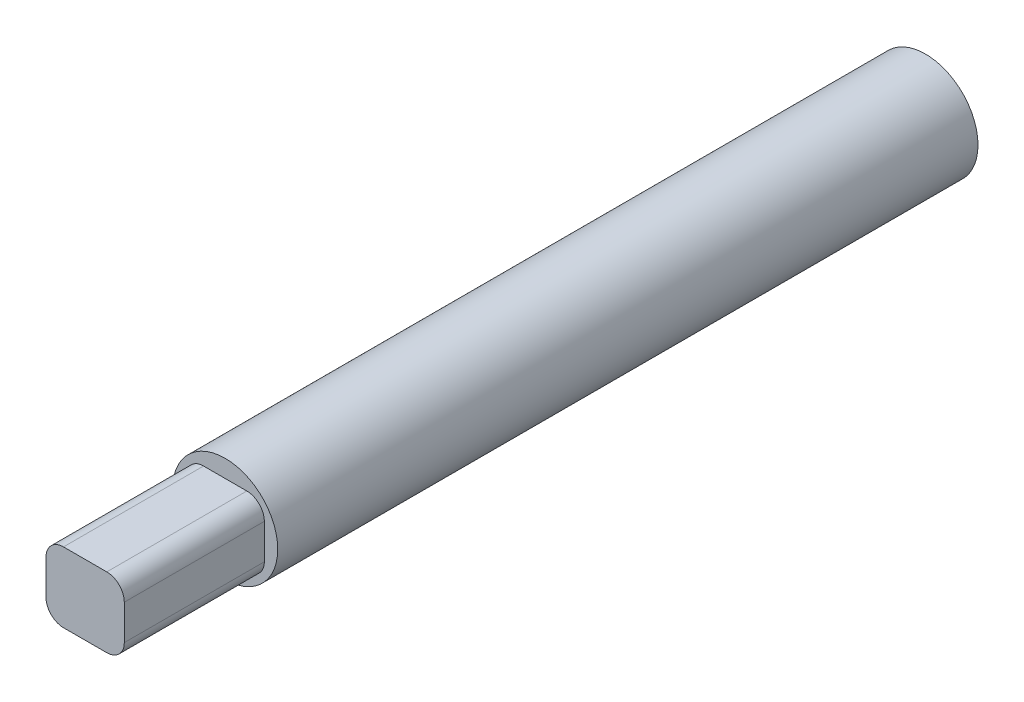
ISO-10303-21;
HEADER;
FILE_DESCRIPTION(('STEP AP214'),'2;1');
FILE_NAME('part.step','',(''),(''),'','','');
FILE_SCHEMA(('AUTOMOTIVE_DESIGN { 1 0 10303 214 1 1 1 1 }'));
ENDSEC;
DATA;
#1=APPLICATION_CONTEXT('core data for automotive mechanical design processes');
#2=APPLICATION_PROTOCOL_DEFINITION('international standard','automotive_design',2000,#1);
#3=PRODUCT_CONTEXT('',#1,'mechanical');
#4=PRODUCT('Part','Part','',(#3));
#5=PRODUCT_RELATED_PRODUCT_CATEGORY('part','',(#4));
#6=PRODUCT_DEFINITION_FORMATION('','',#4);
#7=PRODUCT_DEFINITION_CONTEXT('part definition',#1,'design');
#8=PRODUCT_DEFINITION('design','',#6,#7);
#9=PRODUCT_DEFINITION_SHAPE('','',#8);
#10=(LENGTH_UNIT() NAMED_UNIT(*) SI_UNIT(.MILLI.,.METRE.));
#11=(NAMED_UNIT(*) PLANE_ANGLE_UNIT() SI_UNIT($,.RADIAN.));
#12=(NAMED_UNIT(*) SI_UNIT($,.STERADIAN.) SOLID_ANGLE_UNIT());
#13=UNCERTAINTY_MEASURE_WITH_UNIT(LENGTH_MEASURE(1.E-05),#10,'distance_accuracy_value','');
#14=(GEOMETRIC_REPRESENTATION_CONTEXT(3) GLOBAL_UNCERTAINTY_ASSIGNED_CONTEXT((#13)) GLOBAL_UNIT_ASSIGNED_CONTEXT((#10,
#11,#12)) REPRESENTATION_CONTEXT('',''));
#15=CARTESIAN_POINT('',(0.,0.,0.));
#16=DIRECTION('',(0.,0.,1.));
#17=DIRECTION('',(1.,0.,0.));
#18=AXIS2_PLACEMENT_3D('',#15,#16,#17);
#19=CARTESIAN_POINT('',(0.,0.,40.));
#20=DIRECTION('',(0.,0.,1.));
#21=DIRECTION('',(1.,0.,0.));
#22=AXIS2_PLACEMENT_3D('',#19,#20,#21);
#23=PLANE('',#22);
#24=CARTESIAN_POINT('',(0.,0.,40.));
#25=DIRECTION('',(0.,0.,1.));
#26=DIRECTION('',(1.,0.,0.));
#27=AXIS2_PLACEMENT_3D('',#24,#25,#26);
#28=CIRCLE('',#27,3.);
#29=CARTESIAN_POINT('',(2.23606797749979,2.,40.));
#30=VERTEX_POINT('',#29);
#31=CARTESIAN_POINT('',(-2.23606797749979,2.,40.));
#32=VERTEX_POINT('',#31);
#33=EDGE_CURVE('E127',#30,#32,#28,.T.);
#34=ORIENTED_EDGE('',*,*,#33,.T.);
#35=CARTESIAN_POINT('',(-2.23606797749979,-2.,40.));
#36=VERTEX_POINT('',#35);
#37=EDGE_CURVE('E122',#32,#36,#28,.T.);
#38=ORIENTED_EDGE('',*,*,#37,.T.);
#39=CARTESIAN_POINT('',(2.23606797749979,-2.,40.));
#40=VERTEX_POINT('',#39);
#41=EDGE_CURVE('E116',#36,#40,#28,.T.);
#42=ORIENTED_EDGE('',*,*,#41,.T.);
#43=EDGE_CURVE('E120',#40,#30,#28,.T.);
#44=ORIENTED_EDGE('',*,*,#43,.T.);
#45=EDGE_LOOP('',(#34,#38,#42,#44));
#46=FACE_BOUND('',#45,.T.);
#47=DIRECTION('',(-1.,0.,0.));
#48=VECTOR('',#47,1.);
#49=CARTESIAN_POINT('',(2.23606797749979,2.,40.));
#50=LINE('',#49,#48);
#51=CARTESIAN_POINT('',(1.23606797749979,2.,40.));
#52=VERTEX_POINT('',#51);
#53=CARTESIAN_POINT('',(-1.23606797749979,2.,40.));
#54=VERTEX_POINT('',#53);
#55=EDGE_CURVE('E54',#52,#54,#50,.T.);
#56=ORIENTED_EDGE('',*,*,#55,.F.);
#57=CARTESIAN_POINT('',(1.23606797749979,1.,40.));
#58=DIRECTION('',(0.,0.,1.));
#59=DIRECTION('',(1.,0.,0.));
#60=AXIS2_PLACEMENT_3D('',#57,#58,#59);
#61=CIRCLE('',#60,1.);
#62=CARTESIAN_POINT('',(2.23606797749979,1.,40.));
#63=VERTEX_POINT('',#62);
#64=EDGE_CURVE('E47',#52,#63,#61,.F.);
#65=ORIENTED_EDGE('',*,*,#64,.T.);
#66=DIRECTION('',(0.,1.,0.));
#67=VECTOR('',#66,1.);
#68=CARTESIAN_POINT('',(2.23606797749979,-2.,40.));
#69=LINE('',#68,#67);
#70=CARTESIAN_POINT('',(2.23606797749979,-1.,40.));
#71=VERTEX_POINT('',#70);
#72=EDGE_CURVE('E61',#71,#63,#69,.T.);
#73=ORIENTED_EDGE('',*,*,#72,.F.);
#74=CARTESIAN_POINT('',(1.23606797749979,-1.,40.));
#75=DIRECTION('',(0.,0.,1.));
#76=DIRECTION('',(1.,0.,0.));
#77=AXIS2_PLACEMENT_3D('',#74,#75,#76);
#78=CIRCLE('',#77,1.);
#79=CARTESIAN_POINT('',(1.23606797749979,-2.,40.));
#80=VERTEX_POINT('',#79);
#81=EDGE_CURVE('E163',#71,#80,#78,.F.);
#82=ORIENTED_EDGE('',*,*,#81,.T.);
#83=DIRECTION('',(1.,0.,0.));
#84=VECTOR('',#83,1.);
#85=CARTESIAN_POINT('',(2.23606797749979,-2.,40.));
#86=LINE('',#85,#84);
#87=CARTESIAN_POINT('',(-1.23606797749979,-2.,40.));
#88=VERTEX_POINT('',#87);
#89=EDGE_CURVE('E188',#88,#80,#86,.T.);
#90=ORIENTED_EDGE('',*,*,#89,.F.);
#91=CARTESIAN_POINT('',(-1.23606797749979,-1.,40.));
#92=DIRECTION('',(0.,0.,1.));
#93=DIRECTION('',(1.,0.,0.));
#94=AXIS2_PLACEMENT_3D('',#91,#92,#93);
#95=CIRCLE('',#94,1.);
#96=CARTESIAN_POINT('',(-2.23606797749979,-1.,40.));
#97=VERTEX_POINT('',#96);
#98=EDGE_CURVE('E166',#88,#97,#95,.F.);
#99=ORIENTED_EDGE('',*,*,#98,.T.);
#100=DIRECTION('',(0.,-1.,0.));
#101=VECTOR('',#100,1.);
#102=CARTESIAN_POINT('',(-2.23606797749979,-2.,40.));
#103=LINE('',#102,#101);
#104=CARTESIAN_POINT('',(-2.23606797749979,1.,40.));
#105=VERTEX_POINT('',#104);
#106=EDGE_CURVE('E186',#105,#97,#103,.T.);
#107=ORIENTED_EDGE('',*,*,#106,.F.);
#108=CARTESIAN_POINT('',(-1.23606797749979,1.,40.));
#109=DIRECTION('',(0.,0.,1.));
#110=DIRECTION('',(1.,0.,0.));
#111=AXIS2_PLACEMENT_3D('',#108,#109,#110);
#112=CIRCLE('',#111,1.);
#113=EDGE_CURVE('E11',#105,#54,#112,.F.);
#114=ORIENTED_EDGE('',*,*,#113,.T.);
#115=EDGE_LOOP('',(#56,#65,#73,#82,#90,#99,#107,#114));
#116=FACE_BOUND('',#115,.T.);
#117=ADVANCED_FACE('F39',(#46,#116),#23,.T.);
#118=CARTESIAN_POINT('',(0.,0.,40.));
#119=DIRECTION('',(0.,0.,-1.));
#120=DIRECTION('',(-1.,0.,0.));
#121=AXIS2_PLACEMENT_3D('',#118,#119,#120);
#122=CYLINDRICAL_SURFACE('',#121,3.);
#123=ORIENTED_EDGE('',*,*,#33,.F.);
#124=ORIENTED_EDGE('',*,*,#43,.F.);
#125=ORIENTED_EDGE('',*,*,#41,.F.);
#126=ORIENTED_EDGE('',*,*,#37,.F.);
#127=EDGE_LOOP('',(#123,#124,#125,#126));
#128=FACE_BOUND('',#127,.T.);
#129=CARTESIAN_POINT('',(0.,0.,0.));
#130=DIRECTION('',(0.,0.,1.));
#131=DIRECTION('',(1.,0.,0.));
#132=AXIS2_PLACEMENT_3D('',#129,#130,#131);
#133=CIRCLE('',#132,3.);
#134=CARTESIAN_POINT('',(3.,0.,0.));
#135=VERTEX_POINT('',#134);
#136=EDGE_CURVE('E128',#135,#135,#133,.T.);
#137=ORIENTED_EDGE('',*,*,#136,.T.);
#138=EDGE_LOOP('',(#137));
#139=FACE_BOUND('',#138,.T.);
#140=ADVANCED_FACE('F125',(#128,#139),#122,.T.);
#141=CARTESIAN_POINT('',(0.,0.,0.));
#142=DIRECTION('',(0.,0.,1.));
#143=DIRECTION('',(1.,0.,0.));
#144=AXIS2_PLACEMENT_3D('',#141,#142,#143);
#145=PLANE('',#144);
#146=ORIENTED_EDGE('',*,*,#136,.F.);
#147=EDGE_LOOP('',(#146));
#148=FACE_BOUND('',#147,.T.);
#149=ADVANCED_FACE('F220',(#148),#145,.F.);
#150=CARTESIAN_POINT('',(-2.23606797749979,-2.,48.));
#151=DIRECTION('',(1.,0.,0.));
#152=DIRECTION('',(0.,0.,-1.));
#153=AXIS2_PLACEMENT_3D('',#150,#151,#152);
#154=PLANE('',#153);
#155=ORIENTED_EDGE('',*,*,#106,.T.);
#156=DIRECTION('',(0.,0.,-1.));
#157=VECTOR('',#156,1.);
#158=CARTESIAN_POINT('',(-2.23606797749979,-1.,48.));
#159=LINE('',#158,#157);
#160=CARTESIAN_POINT('',(-2.23606797749979,-1.,48.));
#161=VERTEX_POINT('',#160);
#162=EDGE_CURVE('E157',#97,#161,#159,.F.);
#163=ORIENTED_EDGE('',*,*,#162,.T.);
#164=DIRECTION('',(0.,-1.,0.));
#165=VECTOR('',#164,1.);
#166=CARTESIAN_POINT('',(-2.23606797749979,-2.,48.));
#167=LINE('',#166,#165);
#168=CARTESIAN_POINT('',(-2.23606797749979,1.,48.));
#169=VERTEX_POINT('',#168);
#170=EDGE_CURVE('E190',#169,#161,#167,.T.);
#171=ORIENTED_EDGE('',*,*,#170,.F.);
#172=DIRECTION('',(0.,0.,-1.));
#173=VECTOR('',#172,1.);
#174=CARTESIAN_POINT('',(-2.23606797749979,1.,48.));
#175=LINE('',#174,#173);
#176=EDGE_CURVE('E154',#169,#105,#175,.T.);
#177=ORIENTED_EDGE('',*,*,#176,.T.);
#178=EDGE_LOOP('',(#155,#163,#171,#177));
#179=FACE_BOUND('',#178,.T.);
#180=ADVANCED_FACE('F212',(#179),#154,.F.);
#181=CARTESIAN_POINT('',(2.23606797749979,-2.,48.));
#182=DIRECTION('',(0.,1.,0.));
#183=DIRECTION('',(-1.,0.,0.));
#184=AXIS2_PLACEMENT_3D('',#181,#182,#183);
#185=PLANE('',#184);
#186=ORIENTED_EDGE('',*,*,#89,.T.);
#187=DIRECTION('',(0.,0.,-1.));
#188=VECTOR('',#187,1.);
#189=CARTESIAN_POINT('',(1.23606797749979,-2.,48.));
#190=LINE('',#189,#188);
#191=CARTESIAN_POINT('',(1.23606797749979,-2.,48.));
#192=VERTEX_POINT('',#191);
#193=EDGE_CURVE('E144',#80,#192,#190,.F.);
#194=ORIENTED_EDGE('',*,*,#193,.T.);
#195=DIRECTION('',(1.,0.,0.));
#196=VECTOR('',#195,1.);
#197=CARTESIAN_POINT('',(2.23606797749979,-2.,48.));
#198=LINE('',#197,#196);
#199=CARTESIAN_POINT('',(-1.23606797749979,-2.,48.));
#200=VERTEX_POINT('',#199);
#201=EDGE_CURVE('E182',#200,#192,#198,.T.);
#202=ORIENTED_EDGE('',*,*,#201,.F.);
#203=DIRECTION('',(0.,0.,-1.));
#204=VECTOR('',#203,1.);
#205=CARTESIAN_POINT('',(-1.23606797749979,-2.,48.));
#206=LINE('',#205,#204);
#207=EDGE_CURVE('E139',#200,#88,#206,.T.);
#208=ORIENTED_EDGE('',*,*,#207,.T.);
#209=EDGE_LOOP('',(#186,#194,#202,#208));
#210=FACE_BOUND('',#209,.T.);
#211=ADVANCED_FACE('F205',(#210),#185,.F.);
#212=CARTESIAN_POINT('',(2.23606797749979,-2.,48.));
#213=DIRECTION('',(-1.,0.,0.));
#214=DIRECTION('',(0.,-1.,0.));
#215=AXIS2_PLACEMENT_3D('',#212,#213,#214);
#216=PLANE('',#215);
#217=DIRECTION('',(0.,1.,0.));
#218=VECTOR('',#217,1.);
#219=CARTESIAN_POINT('',(2.23606797749979,-2.,48.));
#220=LINE('',#219,#218);
#221=CARTESIAN_POINT('',(2.23606797749979,-1.,48.));
#222=VERTEX_POINT('',#221);
#223=CARTESIAN_POINT('',(2.23606797749979,1.,48.));
#224=VERTEX_POINT('',#223);
#225=EDGE_CURVE('E178',#222,#224,#220,.T.);
#226=ORIENTED_EDGE('',*,*,#225,.F.);
#227=DIRECTION('',(0.,0.,-1.));
#228=VECTOR('',#227,1.);
#229=CARTESIAN_POINT('',(2.23606797749979,-1.,48.));
#230=LINE('',#229,#228);
#231=EDGE_CURVE('E134',#222,#71,#230,.T.);
#232=ORIENTED_EDGE('',*,*,#231,.T.);
#233=ORIENTED_EDGE('',*,*,#72,.T.);
#234=DIRECTION('',(0.,0.,-1.));
#235=VECTOR('',#234,1.);
#236=CARTESIAN_POINT('',(2.23606797749979,1.,48.));
#237=LINE('',#236,#235);
#238=EDGE_CURVE('E133',#63,#224,#237,.F.);
#239=ORIENTED_EDGE('',*,*,#238,.T.);
#240=EDGE_LOOP('',(#226,#232,#233,#239));
#241=FACE_BOUND('',#240,.T.);
#242=ADVANCED_FACE('F203',(#241),#216,.F.);
#243=CARTESIAN_POINT('',(2.23606797749979,2.,48.));
#244=DIRECTION('',(0.,-1.,0.));
#245=DIRECTION('',(1.,0.,0.));
#246=AXIS2_PLACEMENT_3D('',#243,#244,#245);
#247=PLANE('',#246);
#248=DIRECTION('',(-1.,0.,0.));
#249=VECTOR('',#248,1.);
#250=CARTESIAN_POINT('',(2.23606797749979,2.,48.));
#251=LINE('',#250,#249);
#252=CARTESIAN_POINT('',(1.23606797749979,2.,48.));
#253=VERTEX_POINT('',#252);
#254=CARTESIAN_POINT('',(-1.23606797749979,2.,48.));
#255=VERTEX_POINT('',#254);
#256=EDGE_CURVE('E130',#253,#255,#251,.T.);
#257=ORIENTED_EDGE('',*,*,#256,.F.);
#258=DIRECTION('',(0.,0.,-1.));
#259=VECTOR('',#258,1.);
#260=CARTESIAN_POINT('',(1.23606797749979,2.,48.));
#261=LINE('',#260,#259);
#262=EDGE_CURVE('E161',#253,#52,#261,.T.);
#263=ORIENTED_EDGE('',*,*,#262,.T.);
#264=ORIENTED_EDGE('',*,*,#55,.T.);
#265=DIRECTION('',(0.,0.,-1.));
#266=VECTOR('',#265,1.);
#267=CARTESIAN_POINT('',(-1.23606797749979,2.,48.));
#268=LINE('',#267,#266);
#269=EDGE_CURVE('E159',#54,#255,#268,.F.);
#270=ORIENTED_EDGE('',*,*,#269,.T.);
#271=EDGE_LOOP('',(#257,#263,#264,#270));
#272=FACE_BOUND('',#271,.T.);
#273=ADVANCED_FACE('F179',(#272),#247,.F.);
#274=CARTESIAN_POINT('',(0.,0.,48.));
#275=DIRECTION('',(0.,0.,1.));
#276=DIRECTION('',(1.,0.,0.));
#277=AXIS2_PLACEMENT_3D('',#274,#275,#276);
#278=PLANE('',#277);
#279=ORIENTED_EDGE('',*,*,#201,.T.);
#280=CARTESIAN_POINT('',(1.23606797749979,-1.,48.));
#281=DIRECTION('',(0.,0.,1.));
#282=DIRECTION('',(1.,0.,0.));
#283=AXIS2_PLACEMENT_3D('',#280,#281,#282);
#284=CIRCLE('',#283,1.);
#285=EDGE_CURVE('E152',#192,#222,#284,.T.);
#286=ORIENTED_EDGE('',*,*,#285,.T.);
#287=ORIENTED_EDGE('',*,*,#225,.T.);
#288=CARTESIAN_POINT('',(1.23606797749979,1.,48.));
#289=DIRECTION('',(0.,0.,1.));
#290=DIRECTION('',(1.,0.,0.));
#291=AXIS2_PLACEMENT_3D('',#288,#289,#290);
#292=CIRCLE('',#291,1.);
#293=EDGE_CURVE('E148',#224,#253,#292,.T.);
#294=ORIENTED_EDGE('',*,*,#293,.T.);
#295=ORIENTED_EDGE('',*,*,#256,.T.);
#296=CARTESIAN_POINT('',(-1.23606797749979,1.,48.));
#297=DIRECTION('',(0.,0.,1.));
#298=DIRECTION('',(1.,0.,0.));
#299=AXIS2_PLACEMENT_3D('',#296,#297,#298);
#300=CIRCLE('',#299,1.);
#301=EDGE_CURVE('E146',#255,#169,#300,.T.);
#302=ORIENTED_EDGE('',*,*,#301,.T.);
#303=ORIENTED_EDGE('',*,*,#170,.T.);
#304=CARTESIAN_POINT('',(-1.23606797749979,-1.,48.));
#305=DIRECTION('',(0.,0.,1.));
#306=DIRECTION('',(1.,0.,0.));
#307=AXIS2_PLACEMENT_3D('',#304,#305,#306);
#308=CIRCLE('',#307,1.);
#309=EDGE_CURVE('E150',#161,#200,#308,.T.);
#310=ORIENTED_EDGE('',*,*,#309,.T.);
#311=EDGE_LOOP('',(#279,#286,#287,#294,#295,#302,#303,#310));
#312=FACE_BOUND('',#311,.T.);
#313=ADVANCED_FACE('F176',(#312),#278,.T.);
#314=CARTESIAN_POINT('',(1.23606797749979,-1.,48.));
#315=DIRECTION('',(0.,0.,-1.));
#316=DIRECTION('',(-1.,0.,0.));
#317=AXIS2_PLACEMENT_3D('',#314,#315,#316);
#318=CYLINDRICAL_SURFACE('',#317,1.);
#319=ORIENTED_EDGE('',*,*,#285,.F.);
#320=ORIENTED_EDGE('',*,*,#193,.F.);
#321=ORIENTED_EDGE('',*,*,#81,.F.);
#322=ORIENTED_EDGE('',*,*,#231,.F.);
#323=EDGE_LOOP('',(#319,#320,#321,#322));
#324=FACE_BOUND('',#323,.T.);
#325=ADVANCED_FACE('F202',(#324),#318,.T.);
#326=CARTESIAN_POINT('',(-1.23606797749979,-1.,48.));
#327=DIRECTION('',(0.,0.,-1.));
#328=DIRECTION('',(-1.,0.,0.));
#329=AXIS2_PLACEMENT_3D('',#326,#327,#328);
#330=CYLINDRICAL_SURFACE('',#329,1.);
#331=ORIENTED_EDGE('',*,*,#309,.F.);
#332=ORIENTED_EDGE('',*,*,#162,.F.);
#333=ORIENTED_EDGE('',*,*,#98,.F.);
#334=ORIENTED_EDGE('',*,*,#207,.F.);
#335=EDGE_LOOP('',(#331,#332,#333,#334));
#336=FACE_BOUND('',#335,.T.);
#337=ADVANCED_FACE('F229',(#336),#330,.T.);
#338=CARTESIAN_POINT('',(1.23606797749979,1.,48.));
#339=DIRECTION('',(0.,0.,-1.));
#340=DIRECTION('',(-1.,0.,0.));
#341=AXIS2_PLACEMENT_3D('',#338,#339,#340);
#342=CYLINDRICAL_SURFACE('',#341,1.);
#343=ORIENTED_EDGE('',*,*,#293,.F.);
#344=ORIENTED_EDGE('',*,*,#238,.F.);
#345=ORIENTED_EDGE('',*,*,#64,.F.);
#346=ORIENTED_EDGE('',*,*,#262,.F.);
#347=EDGE_LOOP('',(#343,#344,#345,#346));
#348=FACE_BOUND('',#347,.T.);
#349=ADVANCED_FACE('F171',(#348),#342,.T.);
#350=CARTESIAN_POINT('',(-1.23606797749979,1.,48.));
#351=DIRECTION('',(0.,0.,-1.));
#352=DIRECTION('',(-1.,0.,0.));
#353=AXIS2_PLACEMENT_3D('',#350,#351,#352);
#354=CYLINDRICAL_SURFACE('',#353,1.);
#355=ORIENTED_EDGE('',*,*,#301,.F.);
#356=ORIENTED_EDGE('',*,*,#269,.F.);
#357=ORIENTED_EDGE('',*,*,#113,.F.);
#358=ORIENTED_EDGE('',*,*,#176,.F.);
#359=EDGE_LOOP('',(#355,#356,#357,#358));
#360=FACE_BOUND('',#359,.T.);
#361=ADVANCED_FACE('F41',(#360),#354,.T.);
#362=CLOSED_SHELL('',(#117,#140,#149,#180,#211,#242,#273,#313,#325,#337,#349,#361));
#363=MANIFOLD_SOLID_BREP('B2',#362);
#364=ADVANCED_BREP_SHAPE_REPRESENTATION('',(#18,#363),#14);
#365=SHAPE_DEFINITION_REPRESENTATION(#9,#364);
ENDSEC;
END-ISO-10303-21;
